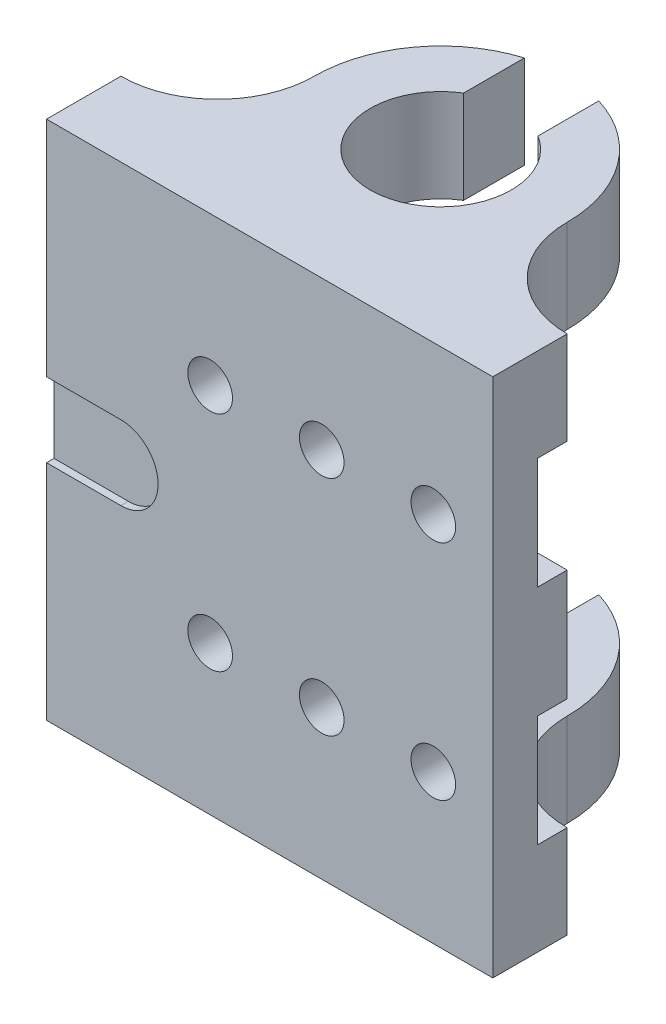
ISO-10303-21;
HEADER;
FILE_DESCRIPTION(('STEP AP214'),'2;1');
FILE_NAME('part.step','',(''),(''),'','','');
FILE_SCHEMA(('AUTOMOTIVE_DESIGN { 1 0 10303 214 1 1 1 1 }'));
ENDSEC;
DATA;
#1=APPLICATION_CONTEXT('core data for automotive mechanical design processes');
#2=APPLICATION_PROTOCOL_DEFINITION('international standard','automotive_design',2000,#1);
#3=PRODUCT_CONTEXT('',#1,'mechanical');
#4=PRODUCT('Part','Part','',(#3));
#5=PRODUCT_RELATED_PRODUCT_CATEGORY('part','',(#4));
#6=PRODUCT_DEFINITION_FORMATION('','',#4);
#7=PRODUCT_DEFINITION_CONTEXT('part definition',#1,'design');
#8=PRODUCT_DEFINITION('design','',#6,#7);
#9=PRODUCT_DEFINITION_SHAPE('','',#8);
#10=(LENGTH_UNIT() NAMED_UNIT(*) SI_UNIT(.MILLI.,.METRE.));
#11=(NAMED_UNIT(*) PLANE_ANGLE_UNIT() SI_UNIT($,.RADIAN.));
#12=(NAMED_UNIT(*) SI_UNIT($,.STERADIAN.) SOLID_ANGLE_UNIT());
#13=UNCERTAINTY_MEASURE_WITH_UNIT(LENGTH_MEASURE(1.E-05),#10,'distance_accuracy_value','');
#14=(GEOMETRIC_REPRESENTATION_CONTEXT(3) GLOBAL_UNCERTAINTY_ASSIGNED_CONTEXT((#13)) GLOBAL_UNIT_ASSIGNED_CONTEXT((#10,
#11,#12)) REPRESENTATION_CONTEXT('',''));
#15=CARTESIAN_POINT('',(0.,0.,0.));
#16=DIRECTION('',(0.,0.,1.));
#17=DIRECTION('',(1.,0.,0.));
#18=AXIS2_PLACEMENT_3D('',#15,#16,#17);
#19=CARTESIAN_POINT('',(-30.,-35.,10.));
#20=DIRECTION('',(0.,1.,0.));
#21=DIRECTION('',(0.,0.,1.));
#22=AXIS2_PLACEMENT_3D('',#19,#20,#21);
#23=PLANE('',#22);
#24=DIRECTION('',(0.,0.,1.));
#25=VECTOR('',#24,1.);
#26=CARTESIAN_POINT('',(-5.,-35.,0.));
#27=LINE('',#26,#25);
#28=CARTESIAN_POINT('',(-5.,-35.,-29.2480768092719));
#29=VERTEX_POINT('',#28);
#30=CARTESIAN_POINT('',(-5.,-35.,-21.0777472107018));
#31=VERTEX_POINT('',#30);
#32=EDGE_CURVE('E250',#29,#31,#27,.T.);
#33=ORIENTED_EDGE('',*,*,#32,.T.);
#34=CARTESIAN_POINT('',(0.,-35.,-13.));
#35=DIRECTION('',(0.,1.,0.));
#36=DIRECTION('',(0.,0.,1.));
#37=AXIS2_PLACEMENT_3D('',#34,#35,#36);
#38=CIRCLE('',#37,9.5);
#39=CARTESIAN_POINT('',(5.,-35.,-21.0777472107018));
#40=VERTEX_POINT('',#39);
#41=EDGE_CURVE('E258',#31,#40,#38,.T.);
#42=ORIENTED_EDGE('',*,*,#41,.T.);
#43=DIRECTION('',(0.,0.,1.));
#44=VECTOR('',#43,1.);
#45=CARTESIAN_POINT('',(5.,-35.,0.));
#46=LINE('',#45,#44);
#47=CARTESIAN_POINT('',(5.,-35.,-29.2480768092719));
#48=VERTEX_POINT('',#47);
#49=EDGE_CURVE('E243',#48,#40,#46,.T.);
#50=ORIENTED_EDGE('',*,*,#49,.F.);
#51=CARTESIAN_POINT('',(0.,-35.,-13.));
#52=DIRECTION('',(0.,1.,0.));
#53=DIRECTION('',(0.,0.,1.));
#54=AXIS2_PLACEMENT_3D('',#51,#52,#53);
#55=CIRCLE('',#54,17.);
#56=CARTESIAN_POINT('',(17.,-35.,-13.));
#57=VERTEX_POINT('',#56);
#58=EDGE_CURVE('E255',#48,#57,#55,.F.);
#59=ORIENTED_EDGE('',*,*,#58,.T.);
#60=CARTESIAN_POINT('',(30.,-35.,-13.));
#61=DIRECTION('',(0.,1.,0.));
#62=DIRECTION('',(0.,0.,1.));
#63=AXIS2_PLACEMENT_3D('',#60,#61,#62);
#64=CIRCLE('',#63,13.);
#65=CARTESIAN_POINT('',(30.,-35.,0.));
#66=VERTEX_POINT('',#65);
#67=EDGE_CURVE('E272',#66,#57,#64,.F.);
#68=ORIENTED_EDGE('',*,*,#67,.F.);
#69=DIRECTION('',(0.,0.,-1.));
#70=VECTOR('',#69,1.);
#71=CARTESIAN_POINT('',(30.,-35.,10.));
#72=LINE('',#71,#70);
#73=CARTESIAN_POINT('',(30.,-35.,10.));
#74=VERTEX_POINT('',#73);
#75=EDGE_CURVE('E536',#74,#66,#72,.T.);
#76=ORIENTED_EDGE('',*,*,#75,.F.);
#77=DIRECTION('',(1.,0.,0.));
#78=VECTOR('',#77,1.);
#79=CARTESIAN_POINT('',(-30.,-35.,10.));
#80=LINE('',#79,#78);
#81=CARTESIAN_POINT('',(-30.,-35.,10.));
#82=VERTEX_POINT('',#81);
#83=EDGE_CURVE('E533',#82,#74,#80,.T.);
#84=ORIENTED_EDGE('',*,*,#83,.F.);
#85=DIRECTION('',(0.,0.,-1.));
#86=VECTOR('',#85,1.);
#87=CARTESIAN_POINT('',(-30.,-35.,10.));
#88=LINE('',#87,#86);
#89=CARTESIAN_POINT('',(-30.,-35.,0.));
#90=VERTEX_POINT('',#89);
#91=EDGE_CURVE('E547',#82,#90,#88,.T.);
#92=ORIENTED_EDGE('',*,*,#91,.T.);
#93=CARTESIAN_POINT('',(-30.,-35.,-13.));
#94=DIRECTION('',(0.,1.,0.));
#95=DIRECTION('',(0.,0.,1.));
#96=AXIS2_PLACEMENT_3D('',#93,#94,#95);
#97=CIRCLE('',#96,13.);
#98=CARTESIAN_POINT('',(-17.,-35.,-13.));
#99=VERTEX_POINT('',#98);
#100=EDGE_CURVE('E267',#90,#99,#97,.T.);
#101=ORIENTED_EDGE('',*,*,#100,.T.);
#102=EDGE_CURVE('E266',#99,#29,#55,.F.);
#103=ORIENTED_EDGE('',*,*,#102,.T.);
#104=EDGE_LOOP('',(#33,#42,#50,#59,#68,#76,#84,#92,#101,#103));
#105=FACE_BOUND('',#104,.T.);
#106=ADVANCED_FACE('F47',(#105),#23,.F.);
#107=CARTESIAN_POINT('',(0.,-22.5,4.));
#108=DIRECTION('',(0.,1.,0.));
#109=DIRECTION('',(0.,0.,1.));
#110=AXIS2_PLACEMENT_3D('',#107,#108,#109);
#111=PLANE('',#110);
#112=CARTESIAN_POINT('',(0.,-22.5,-13.));
#113=DIRECTION('',(0.,-1.,0.));
#114=DIRECTION('',(0.,0.,-1.));
#115=AXIS2_PLACEMENT_3D('',#112,#113,#114);
#116=CIRCLE('',#115,9.5);
#117=CARTESIAN_POINT('',(5.,-22.5,-21.0777472107018));
#118=VERTEX_POINT('',#117);
#119=CARTESIAN_POINT('',(-5.,-22.5,-21.0777472107018));
#120=VERTEX_POINT('',#119);
#121=EDGE_CURVE('E604',#118,#120,#116,.T.);
#122=ORIENTED_EDGE('',*,*,#121,.T.);
#123=DIRECTION('',(0.,0.,-1.));
#124=VECTOR('',#123,1.);
#125=CARTESIAN_POINT('',(-5.,-22.5,0.));
#126=LINE('',#125,#124);
#127=CARTESIAN_POINT('',(-5.,-22.5,-29.2480768092719));
#128=VERTEX_POINT('',#127);
#129=EDGE_CURVE('E593',#120,#128,#126,.T.);
#130=ORIENTED_EDGE('',*,*,#129,.T.);
#131=CARTESIAN_POINT('',(0.,-22.5,-13.));
#132=DIRECTION('',(0.,1.,0.));
#133=DIRECTION('',(0.,0.,1.));
#134=AXIS2_PLACEMENT_3D('',#131,#132,#133);
#135=CIRCLE('',#134,17.);
#136=CARTESIAN_POINT('',(-17.,-22.5,-13.));
#137=VERTEX_POINT('',#136);
#138=EDGE_CURVE('E580',#137,#128,#135,.F.);
#139=ORIENTED_EDGE('',*,*,#138,.F.);
#140=CARTESIAN_POINT('',(-30.,-22.5,-13.));
#141=DIRECTION('',(0.,1.,0.));
#142=DIRECTION('',(0.,0.,1.));
#143=AXIS2_PLACEMENT_3D('',#140,#141,#142);
#144=CIRCLE('',#143,13.);
#145=CARTESIAN_POINT('',(-30.,-22.5,0.));
#146=VERTEX_POINT('',#145);
#147=EDGE_CURVE('E586',#146,#137,#144,.T.);
#148=ORIENTED_EDGE('',*,*,#147,.F.);
#149=DIRECTION('',(-1.,0.,0.));
#150=VECTOR('',#149,1.);
#151=CARTESIAN_POINT('',(0.,-22.5,0.));
#152=LINE('',#151,#150);
#153=CARTESIAN_POINT('',(-8.,-22.5,0.));
#154=VERTEX_POINT('',#153);
#155=EDGE_CURVE('E71',#154,#146,#152,.T.);
#156=ORIENTED_EDGE('',*,*,#155,.F.);
#157=DIRECTION('',(0.,0.,-1.));
#158=VECTOR('',#157,1.);
#159=CARTESIAN_POINT('',(-8.,-22.5,4.));
#160=LINE('',#159,#158);
#161=CARTESIAN_POINT('',(-8.,-22.5,4.));
#162=VERTEX_POINT('',#161);
#163=EDGE_CURVE('E431',#162,#154,#160,.T.);
#164=ORIENTED_EDGE('',*,*,#163,.F.);
#165=DIRECTION('',(1.,0.,0.));
#166=VECTOR('',#165,1.);
#167=CARTESIAN_POINT('',(0.,-22.5,4.));
#168=LINE('',#167,#166);
#169=CARTESIAN_POINT('',(30.,-22.5,4.));
#170=VERTEX_POINT('',#169);
#171=EDGE_CURVE('E415',#162,#170,#168,.T.);
#172=ORIENTED_EDGE('',*,*,#171,.T.);
#173=DIRECTION('',(0.,0.,-1.));
#174=VECTOR('',#173,1.);
#175=CARTESIAN_POINT('',(30.,-22.5,4.));
#176=LINE('',#175,#174);
#177=CARTESIAN_POINT('',(30.,-22.5,0.));
#178=VERTEX_POINT('',#177);
#179=EDGE_CURVE('E435',#170,#178,#176,.T.);
#180=ORIENTED_EDGE('',*,*,#179,.T.);
#181=CARTESIAN_POINT('',(30.,-22.5,-13.));
#182=DIRECTION('',(0.,1.,0.));
#183=DIRECTION('',(0.,0.,1.));
#184=AXIS2_PLACEMENT_3D('',#181,#182,#183);
#185=CIRCLE('',#184,13.);
#186=CARTESIAN_POINT('',(17.,-22.5,-13.));
#187=VERTEX_POINT('',#186);
#188=EDGE_CURVE('E288',#178,#187,#185,.F.);
#189=ORIENTED_EDGE('',*,*,#188,.T.);
#190=CARTESIAN_POINT('',(5.,-22.5,-29.2480768092719));
#191=VERTEX_POINT('',#190);
#192=EDGE_CURVE('E583',#191,#187,#135,.F.);
#193=ORIENTED_EDGE('',*,*,#192,.F.);
#194=DIRECTION('',(0.,0.,-1.));
#195=VECTOR('',#194,1.);
#196=CARTESIAN_POINT('',(5.,-22.5,0.));
#197=LINE('',#196,#195);
#198=EDGE_CURVE('E63',#118,#191,#197,.T.);
#199=ORIENTED_EDGE('',*,*,#198,.F.);
#200=EDGE_LOOP('',(#122,#130,#139,#148,#156,#164,#172,#180,#189,#193,#199));
#201=FACE_BOUND('',#200,.T.);
#202=ADVANCED_FACE('F615',(#201),#111,.T.);
#203=CARTESIAN_POINT('',(0.,-22.5,-13.));
#204=DIRECTION('',(0.,-1.,0.));
#205=DIRECTION('',(0.,0.,-1.));
#206=AXIS2_PLACEMENT_3D('',#203,#204,#205);
#207=CYLINDRICAL_SURFACE('',#206,17.);
#208=ORIENTED_EDGE('',*,*,#138,.T.);
#209=DIRECTION('',(0.,-1.,0.));
#210=VECTOR('',#209,1.);
#211=CARTESIAN_POINT('',(-5.,55.1075144713607,-29.2480768092719));
#212=LINE('',#211,#210);
#213=EDGE_CURVE('E600',#128,#29,#212,.T.);
#214=ORIENTED_EDGE('',*,*,#213,.T.);
#215=ORIENTED_EDGE('',*,*,#102,.F.);
#216=DIRECTION('',(0.,-1.,0.));
#217=VECTOR('',#216,1.);
#218=CARTESIAN_POINT('',(-17.,-22.5,-13.));
#219=LINE('',#218,#217);
#220=EDGE_CURVE('E282',#137,#99,#219,.T.);
#221=ORIENTED_EDGE('',*,*,#220,.F.);
#222=EDGE_LOOP('',(#208,#214,#215,#221));
#223=FACE_BOUND('',#222,.T.);
#224=ADVANCED_FACE('F624',(#223),#207,.T.);
#225=CARTESIAN_POINT('',(0.,0.,0.));
#226=DIRECTION('',(0.,0.,1.));
#227=DIRECTION('',(1.,0.,0.));
#228=AXIS2_PLACEMENT_3D('',#225,#226,#227);
#229=PLANE('',#228);
#230=ORIENTED_EDGE('',*,*,#155,.T.);
#231=DIRECTION('',(0.,-1.,0.));
#232=VECTOR('',#231,1.);
#233=CARTESIAN_POINT('',(-30.,35.,0.));
#234=LINE('',#233,#232);
#235=CARTESIAN_POINT('',(-30.,22.5,0.));
#236=VERTEX_POINT('',#235);
#237=EDGE_CURVE('E540',#236,#146,#234,.T.);
#238=ORIENTED_EDGE('',*,*,#237,.F.);
#239=DIRECTION('',(-1.,0.,0.));
#240=VECTOR('',#239,1.);
#241=CARTESIAN_POINT('',(0.,22.5,0.));
#242=LINE('',#241,#240);
#243=CARTESIAN_POINT('',(-8.,22.5,0.));
#244=VERTEX_POINT('',#243);
#245=EDGE_CURVE('E324',#244,#236,#242,.T.);
#246=ORIENTED_EDGE('',*,*,#245,.F.);
#247=CARTESIAN_POINT('',(-8.,15.,0.));
#248=DIRECTION('',(0.,0.,-1.));
#249=DIRECTION('',(-1.,0.,0.));
#250=AXIS2_PLACEMENT_3D('',#247,#248,#249);
#251=CIRCLE('',#250,7.5);
#252=CARTESIAN_POINT('',(-8.00000000000001,7.5,0.));
#253=VERTEX_POINT('',#252);
#254=EDGE_CURVE('E434',#253,#244,#251,.T.);
#255=ORIENTED_EDGE('',*,*,#254,.F.);
#256=DIRECTION('',(1.,0.,0.));
#257=VECTOR('',#256,1.);
#258=CARTESIAN_POINT('',(0.,7.5,0.));
#259=LINE('',#258,#257);
#260=CARTESIAN_POINT('',(30.,7.5,0.));
#261=VERTEX_POINT('',#260);
#262=EDGE_CURVE('E451',#253,#261,#259,.T.);
#263=ORIENTED_EDGE('',*,*,#262,.T.);
#264=DIRECTION('',(0.,1.,0.));
#265=VECTOR('',#264,1.);
#266=CARTESIAN_POINT('',(30.,35.,0.));
#267=LINE('',#266,#265);
#268=CARTESIAN_POINT('',(30.,-7.5,0.));
#269=VERTEX_POINT('',#268);
#270=EDGE_CURVE('E541',#269,#261,#267,.T.);
#271=ORIENTED_EDGE('',*,*,#270,.F.);
#272=DIRECTION('',(1.,0.,0.));
#273=VECTOR('',#272,1.);
#274=CARTESIAN_POINT('',(0.,-7.5,0.));
#275=LINE('',#274,#273);
#276=CARTESIAN_POINT('',(-8.00000000000001,-7.5,0.));
#277=VERTEX_POINT('',#276);
#278=EDGE_CURVE('E403',#277,#269,#275,.T.);
#279=ORIENTED_EDGE('',*,*,#278,.F.);
#280=CARTESIAN_POINT('',(-8.,-15.,0.));
#281=DIRECTION('',(0.,0.,1.));
#282=DIRECTION('',(-1.,0.,0.));
#283=AXIS2_PLACEMENT_3D('',#280,#281,#282);
#284=CIRCLE('',#283,7.5);
#285=EDGE_CURVE('E387',#277,#154,#284,.T.);
#286=ORIENTED_EDGE('',*,*,#285,.T.);
#287=EDGE_LOOP('',(#230,#238,#246,#255,#263,#271,#279,#286));
#288=FACE_BOUND('',#287,.T.);
#289=ADVANCED_FACE('F568',(#288),#229,.F.);
#290=CARTESIAN_POINT('',(-30.,35.,10.));
#291=DIRECTION('',(0.,-1.,0.));
#292=DIRECTION('',(0.,0.,-1.));
#293=AXIS2_PLACEMENT_3D('',#290,#291,#292);
#294=PLANE('',#293);
#295=DIRECTION('',(0.,0.,1.));
#296=VECTOR('',#295,1.);
#297=CARTESIAN_POINT('',(5.,35.,0.));
#298=LINE('',#297,#296);
#299=CARTESIAN_POINT('',(5.,35.,-29.2480768092719));
#300=VERTEX_POINT('',#299);
#301=CARTESIAN_POINT('',(5.,35.,-21.0777472107018));
#302=VERTEX_POINT('',#301);
#303=EDGE_CURVE('E305',#300,#302,#298,.T.);
#304=ORIENTED_EDGE('',*,*,#303,.T.);
#305=CARTESIAN_POINT('',(0.,35.,-13.));
#306=DIRECTION('',(0.,1.,0.));
#307=DIRECTION('',(0.,0.,1.));
#308=AXIS2_PLACEMENT_3D('',#305,#306,#307);
#309=CIRCLE('',#308,9.5);
#310=CARTESIAN_POINT('',(-5.,35.,-21.0777472107018));
#311=VERTEX_POINT('',#310);
#312=EDGE_CURVE('E301',#311,#302,#309,.T.);
#313=ORIENTED_EDGE('',*,*,#312,.F.);
#314=DIRECTION('',(0.,0.,1.));
#315=VECTOR('',#314,1.);
#316=CARTESIAN_POINT('',(-5.,35.,0.));
#317=LINE('',#316,#315);
#318=CARTESIAN_POINT('',(-5.,35.,-29.2480768092719));
#319=VERTEX_POINT('',#318);
#320=EDGE_CURVE('E281',#319,#311,#317,.T.);
#321=ORIENTED_EDGE('',*,*,#320,.F.);
#322=CARTESIAN_POINT('',(0.,35.,-13.));
#323=DIRECTION('',(0.,1.,0.));
#324=DIRECTION('',(0.,0.,1.));
#325=AXIS2_PLACEMENT_3D('',#322,#323,#324);
#326=CIRCLE('',#325,17.);
#327=CARTESIAN_POINT('',(-17.,35.,-13.));
#328=VERTEX_POINT('',#327);
#329=EDGE_CURVE('E345',#328,#319,#326,.F.);
#330=ORIENTED_EDGE('',*,*,#329,.F.);
#331=CARTESIAN_POINT('',(-30.,35.,-13.));
#332=DIRECTION('',(0.,1.,0.));
#333=DIRECTION('',(0.,0.,1.));
#334=AXIS2_PLACEMENT_3D('',#331,#332,#333);
#335=CIRCLE('',#334,13.);
#336=CARTESIAN_POINT('',(-30.,35.,0.));
#337=VERTEX_POINT('',#336);
#338=EDGE_CURVE('E328',#337,#328,#335,.T.);
#339=ORIENTED_EDGE('',*,*,#338,.F.);
#340=DIRECTION('',(0.,0.,-1.));
#341=VECTOR('',#340,1.);
#342=CARTESIAN_POINT('',(-30.,35.,10.));
#343=LINE('',#342,#341);
#344=CARTESIAN_POINT('',(-30.,35.,10.));
#345=VERTEX_POINT('',#344);
#346=EDGE_CURVE('E56',#345,#337,#343,.T.);
#347=ORIENTED_EDGE('',*,*,#346,.F.);
#348=DIRECTION('',(-1.,0.,0.));
#349=VECTOR('',#348,1.);
#350=CARTESIAN_POINT('',(-30.,35.,10.));
#351=LINE('',#350,#349);
#352=CARTESIAN_POINT('',(30.,35.,10.));
#353=VERTEX_POINT('',#352);
#354=EDGE_CURVE('E524',#353,#345,#351,.T.);
#355=ORIENTED_EDGE('',*,*,#354,.F.);
#356=DIRECTION('',(0.,0.,-1.));
#357=VECTOR('',#356,1.);
#358=CARTESIAN_POINT('',(30.,35.,10.));
#359=LINE('',#358,#357);
#360=CARTESIAN_POINT('',(30.,35.,0.));
#361=VERTEX_POINT('',#360);
#362=EDGE_CURVE('E11',#353,#361,#359,.T.);
#363=ORIENTED_EDGE('',*,*,#362,.T.);
#364=CARTESIAN_POINT('',(30.,35.,-13.));
#365=DIRECTION('',(0.,1.,0.));
#366=DIRECTION('',(0.,0.,1.));
#367=AXIS2_PLACEMENT_3D('',#364,#365,#366);
#368=CIRCLE('',#367,13.);
#369=CARTESIAN_POINT('',(17.,35.,-13.));
#370=VERTEX_POINT('',#369);
#371=EDGE_CURVE('E323',#361,#370,#368,.F.);
#372=ORIENTED_EDGE('',*,*,#371,.T.);
#373=EDGE_CURVE('E344',#300,#370,#326,.F.);
#374=ORIENTED_EDGE('',*,*,#373,.F.);
#375=EDGE_LOOP('',(#304,#313,#321,#330,#339,#347,#355,#363,#372,#374));
#376=FACE_BOUND('',#375,.T.);
#377=ADVANCED_FACE('F559',(#376),#294,.F.);
#378=CARTESIAN_POINT('',(0.,22.5,4.));
#379=DIRECTION('',(0.,1.,0.));
#380=DIRECTION('',(0.,0.,1.));
#381=AXIS2_PLACEMENT_3D('',#378,#379,#380);
#382=PLANE('',#381);
#383=DIRECTION('',(0.,0.,-1.));
#384=VECTOR('',#383,1.);
#385=CARTESIAN_POINT('',(5.,22.5,0.));
#386=LINE('',#385,#384);
#387=CARTESIAN_POINT('',(5.,22.5,-21.0777472107018));
#388=VERTEX_POINT('',#387);
#389=CARTESIAN_POINT('',(5.,22.5,-29.2480768092719));
#390=VERTEX_POINT('',#389);
#391=EDGE_CURVE('E292',#388,#390,#386,.T.);
#392=ORIENTED_EDGE('',*,*,#391,.T.);
#393=CARTESIAN_POINT('',(0.,22.5,-13.));
#394=DIRECTION('',(0.,1.,0.));
#395=DIRECTION('',(0.,0.,1.));
#396=AXIS2_PLACEMENT_3D('',#393,#394,#395);
#397=CIRCLE('',#396,17.);
#398=CARTESIAN_POINT('',(17.,22.5,-13.));
#399=VERTEX_POINT('',#398);
#400=EDGE_CURVE('E332',#390,#399,#397,.F.);
#401=ORIENTED_EDGE('',*,*,#400,.T.);
#402=CARTESIAN_POINT('',(30.,22.5,-13.));
#403=DIRECTION('',(0.,1.,0.));
#404=DIRECTION('',(0.,0.,1.));
#405=AXIS2_PLACEMENT_3D('',#402,#403,#404);
#406=CIRCLE('',#405,13.);
#407=CARTESIAN_POINT('',(30.,22.5,0.));
#408=VERTEX_POINT('',#407);
#409=EDGE_CURVE('E327',#408,#399,#406,.F.);
#410=ORIENTED_EDGE('',*,*,#409,.F.);
#411=DIRECTION('',(0.,0.,-1.));
#412=VECTOR('',#411,1.);
#413=CARTESIAN_POINT('',(30.,22.5,4.));
#414=LINE('',#413,#412);
#415=CARTESIAN_POINT('',(30.,22.5,4.));
#416=VERTEX_POINT('',#415);
#417=EDGE_CURVE('E489',#416,#408,#414,.T.);
#418=ORIENTED_EDGE('',*,*,#417,.F.);
#419=DIRECTION('',(1.,0.,0.));
#420=VECTOR('',#419,1.);
#421=CARTESIAN_POINT('',(0.,22.5,4.));
#422=LINE('',#421,#420);
#423=CARTESIAN_POINT('',(-8.,22.5,4.));
#424=VERTEX_POINT('',#423);
#425=EDGE_CURVE('E455',#424,#416,#422,.T.);
#426=ORIENTED_EDGE('',*,*,#425,.F.);
#427=DIRECTION('',(0.,0.,-1.));
#428=VECTOR('',#427,1.);
#429=CARTESIAN_POINT('',(-8.,22.5,4.));
#430=LINE('',#429,#428);
#431=EDGE_CURVE('E474',#424,#244,#430,.T.);
#432=ORIENTED_EDGE('',*,*,#431,.T.);
#433=ORIENTED_EDGE('',*,*,#245,.T.);
#434=CARTESIAN_POINT('',(-30.,22.5,-13.));
#435=DIRECTION('',(0.,1.,0.));
#436=DIRECTION('',(0.,0.,1.));
#437=AXIS2_PLACEMENT_3D('',#434,#435,#436);
#438=CIRCLE('',#437,13.);
#439=CARTESIAN_POINT('',(-17.,22.5,-13.));
#440=VERTEX_POINT('',#439);
#441=EDGE_CURVE('E337',#236,#440,#438,.T.);
#442=ORIENTED_EDGE('',*,*,#441,.T.);
#443=CARTESIAN_POINT('',(-5.,22.5,-29.2480768092719));
#444=VERTEX_POINT('',#443);
#445=EDGE_CURVE('E333',#440,#444,#397,.F.);
#446=ORIENTED_EDGE('',*,*,#445,.T.);
#447=DIRECTION('',(0.,0.,-1.));
#448=VECTOR('',#447,1.);
#449=CARTESIAN_POINT('',(-5.,22.5,0.));
#450=LINE('',#449,#448);
#451=CARTESIAN_POINT('',(-5.,22.5,-21.0777472107018));
#452=VERTEX_POINT('',#451);
#453=EDGE_CURVE('E297',#452,#444,#450,.T.);
#454=ORIENTED_EDGE('',*,*,#453,.F.);
#455=CARTESIAN_POINT('',(0.,22.5,-13.));
#456=DIRECTION('',(0.,1.,0.));
#457=DIRECTION('',(0.,0.,1.));
#458=AXIS2_PLACEMENT_3D('',#455,#456,#457);
#459=CIRCLE('',#458,9.5);
#460=EDGE_CURVE('E289',#388,#452,#459,.F.);
#461=ORIENTED_EDGE('',*,*,#460,.F.);
#462=EDGE_LOOP('',(#392,#401,#410,#418,#426,#432,#433,#442,#446,#454,#461));
#463=FACE_BOUND('',#462,.T.);
#464=ADVANCED_FACE('F683',(#463),#382,.F.);
#465=CARTESIAN_POINT('',(0.,22.5,-13.));
#466=DIRECTION('',(0.,1.,0.));
#467=DIRECTION('',(0.,0.,1.));
#468=AXIS2_PLACEMENT_3D('',#465,#466,#467);
#469=CYLINDRICAL_SURFACE('',#468,17.);
#470=DIRECTION('',(0.,1.,0.));
#471=VECTOR('',#470,1.);
#472=CARTESIAN_POINT('',(5.,-10.1075144713607,-29.2480768092719));
#473=LINE('',#472,#471);
#474=EDGE_CURVE('E293',#390,#300,#473,.T.);
#475=ORIENTED_EDGE('',*,*,#474,.T.);
#476=ORIENTED_EDGE('',*,*,#373,.T.);
#477=DIRECTION('',(0.,1.,0.));
#478=VECTOR('',#477,1.);
#479=CARTESIAN_POINT('',(17.,22.5,-13.));
#480=LINE('',#479,#478);
#481=EDGE_CURVE('E340',#399,#370,#480,.T.);
#482=ORIENTED_EDGE('',*,*,#481,.F.);
#483=ORIENTED_EDGE('',*,*,#400,.F.);
#484=EDGE_LOOP('',(#475,#476,#482,#483));
#485=FACE_BOUND('',#484,.T.);
#486=ADVANCED_FACE('F681',(#485),#469,.T.);
#487=CARTESIAN_POINT('',(-30.,35.,10.));
#488=DIRECTION('',(1.,0.,0.));
#489=DIRECTION('',(0.,1.,0.));
#490=AXIS2_PLACEMENT_3D('',#487,#488,#489);
#491=PLANE('',#490);
#492=DIRECTION('',(0.,0.,1.));
#493=VECTOR('',#492,1.);
#494=CARTESIAN_POINT('',(-30.,-5.,9.));
#495=LINE('',#494,#493);
#496=CARTESIAN_POINT('',(-30.,-5.,9.));
#497=VERTEX_POINT('',#496);
#498=CARTESIAN_POINT('',(-30.,-5.,10.));
#499=VERTEX_POINT('',#498);
#500=EDGE_CURVE('E388',#497,#499,#495,.T.);
#501=ORIENTED_EDGE('',*,*,#500,.F.);
#502=DIRECTION('',(0.,-1.,0.));
#503=VECTOR('',#502,1.);
#504=CARTESIAN_POINT('',(-30.,0.,9.));
#505=LINE('',#504,#503);
#506=CARTESIAN_POINT('',(-30.,5.,9.));
#507=VERTEX_POINT('',#506);
#508=EDGE_CURVE('E368',#507,#497,#505,.T.);
#509=ORIENTED_EDGE('',*,*,#508,.F.);
#510=DIRECTION('',(0.,0.,1.));
#511=VECTOR('',#510,1.);
#512=CARTESIAN_POINT('',(-30.,5.,9.));
#513=LINE('',#512,#511);
#514=CARTESIAN_POINT('',(-30.,5.,10.));
#515=VERTEX_POINT('',#514);
#516=EDGE_CURVE('E391',#507,#515,#513,.T.);
#517=ORIENTED_EDGE('',*,*,#516,.T.);
#518=DIRECTION('',(0.,-1.,0.));
#519=VECTOR('',#518,1.);
#520=CARTESIAN_POINT('',(-30.,35.,10.));
#521=LINE('',#520,#519);
#522=EDGE_CURVE('E529',#345,#515,#521,.T.);
#523=ORIENTED_EDGE('',*,*,#522,.F.);
#524=ORIENTED_EDGE('',*,*,#346,.T.);
#525=EDGE_CURVE('E525',#337,#236,#234,.T.);
#526=ORIENTED_EDGE('',*,*,#525,.T.);
#527=ORIENTED_EDGE('',*,*,#237,.T.);
#528=DIRECTION('',(0.,-1.,0.));
#529=VECTOR('',#528,1.);
#530=CARTESIAN_POINT('',(-30.,-22.5,0.));
#531=LINE('',#530,#529);
#532=EDGE_CURVE('E285',#146,#90,#531,.T.);
#533=ORIENTED_EDGE('',*,*,#532,.T.);
#534=ORIENTED_EDGE('',*,*,#91,.F.);
#535=EDGE_CURVE('E528',#499,#82,#521,.T.);
#536=ORIENTED_EDGE('',*,*,#535,.F.);
#537=EDGE_LOOP('',(#501,#509,#517,#523,#524,#526,#527,#533,#534,#536));
#538=FACE_BOUND('',#537,.T.);
#539=ADVANCED_FACE('F556',(#538),#491,.F.);
#540=CARTESIAN_POINT('',(0.,0.,10.));
#541=DIRECTION('',(0.,0.,1.));
#542=DIRECTION('',(1.,0.,0.));
#543=AXIS2_PLACEMENT_3D('',#540,#541,#542);
#544=PLANE('',#543);
#545=CARTESIAN_POINT('',(22.,-15.,10.));
#546=DIRECTION('',(0.,0.,1.));
#547=DIRECTION('',(1.,0.,0.));
#548=AXIS2_PLACEMENT_3D('',#545,#546,#547);
#549=CIRCLE('',#548,3.);
#550=CARTESIAN_POINT('',(25.,-15.,10.));
#551=VERTEX_POINT('',#550);
#552=EDGE_CURVE('E484',#551,#551,#549,.T.);
#553=ORIENTED_EDGE('',*,*,#552,.F.);
#554=EDGE_LOOP('',(#553));
#555=FACE_BOUND('',#554,.T.);
#556=CARTESIAN_POINT('',(7.,-15.,10.));
#557=DIRECTION('',(0.,0.,1.));
#558=DIRECTION('',(1.,0.,0.));
#559=AXIS2_PLACEMENT_3D('',#556,#557,#558);
#560=CIRCLE('',#559,3.);
#561=CARTESIAN_POINT('',(10.,-15.,10.));
#562=VERTEX_POINT('',#561);
#563=EDGE_CURVE('E509',#562,#562,#560,.T.);
#564=ORIENTED_EDGE('',*,*,#563,.F.);
#565=EDGE_LOOP('',(#564));
#566=FACE_BOUND('',#565,.T.);
#567=CARTESIAN_POINT('',(-8.,-15.,10.));
#568=DIRECTION('',(0.,0.,1.));
#569=DIRECTION('',(1.,0.,0.));
#570=AXIS2_PLACEMENT_3D('',#567,#568,#569);
#571=CIRCLE('',#570,3.);
#572=CARTESIAN_POINT('',(-5.,-15.,10.));
#573=VERTEX_POINT('',#572);
#574=EDGE_CURVE('E505',#573,#573,#571,.T.);
#575=ORIENTED_EDGE('',*,*,#574,.F.);
#576=EDGE_LOOP('',(#575));
#577=FACE_BOUND('',#576,.T.);
#578=CARTESIAN_POINT('',(7.,15.,10.));
#579=DIRECTION('',(0.,0.,1.));
#580=DIRECTION('',(1.,0.,0.));
#581=AXIS2_PLACEMENT_3D('',#578,#579,#580);
#582=CIRCLE('',#581,3.);
#583=CARTESIAN_POINT('',(10.,15.,10.));
#584=VERTEX_POINT('',#583);
#585=EDGE_CURVE('E501',#584,#584,#582,.T.);
#586=ORIENTED_EDGE('',*,*,#585,.F.);
#587=EDGE_LOOP('',(#586));
#588=FACE_BOUND('',#587,.T.);
#589=CARTESIAN_POINT('',(-8.,15.,10.));
#590=DIRECTION('',(0.,0.,1.));
#591=DIRECTION('',(1.,0.,0.));
#592=AXIS2_PLACEMENT_3D('',#589,#590,#591);
#593=CIRCLE('',#592,3.);
#594=CARTESIAN_POINT('',(-5.,15.,10.));
#595=VERTEX_POINT('',#594);
#596=EDGE_CURVE('E496',#595,#595,#593,.T.);
#597=ORIENTED_EDGE('',*,*,#596,.F.);
#598=EDGE_LOOP('',(#597));
#599=FACE_BOUND('',#598,.T.);
#600=CARTESIAN_POINT('',(22.,15.,10.));
#601=DIRECTION('',(0.,0.,1.));
#602=DIRECTION('',(1.,0.,0.));
#603=AXIS2_PLACEMENT_3D('',#600,#601,#602);
#604=CIRCLE('',#603,3.);
#605=CARTESIAN_POINT('',(25.,15.,10.));
#606=VERTEX_POINT('',#605);
#607=EDGE_CURVE('E500',#606,#606,#604,.T.);
#608=ORIENTED_EDGE('',*,*,#607,.F.);
#609=EDGE_LOOP('',(#608));
#610=FACE_BOUND('',#609,.T.);
#611=CARTESIAN_POINT('',(-20.,0.,10.));
#612=DIRECTION('',(0.,0.,1.));
#613=DIRECTION('',(1.,0.,0.));
#614=AXIS2_PLACEMENT_3D('',#611,#612,#613);
#615=CIRCLE('',#614,5.);
#616=CARTESIAN_POINT('',(-20.,-5.,10.));
#617=VERTEX_POINT('',#616);
#618=CARTESIAN_POINT('',(-20.,5.,10.));
#619=VERTEX_POINT('',#618);
#620=EDGE_CURVE('E355',#617,#619,#615,.T.);
#621=ORIENTED_EDGE('',*,*,#620,.F.);
#622=DIRECTION('',(-1.,0.,0.));
#623=VECTOR('',#622,1.);
#624=CARTESIAN_POINT('',(0.,-5.,10.));
#625=LINE('',#624,#623);
#626=EDGE_CURVE('E364',#617,#499,#625,.T.);
#627=ORIENTED_EDGE('',*,*,#626,.T.);
#628=ORIENTED_EDGE('',*,*,#535,.T.);
#629=ORIENTED_EDGE('',*,*,#83,.T.);
#630=DIRECTION('',(0.,1.,0.));
#631=VECTOR('',#630,1.);
#632=CARTESIAN_POINT('',(30.,35.,10.));
#633=LINE('',#632,#631);
#634=EDGE_CURVE('E520',#74,#353,#633,.T.);
#635=ORIENTED_EDGE('',*,*,#634,.T.);
#636=ORIENTED_EDGE('',*,*,#354,.T.);
#637=ORIENTED_EDGE('',*,*,#522,.T.);
#638=DIRECTION('',(-1.,0.,0.));
#639=VECTOR('',#638,1.);
#640=CARTESIAN_POINT('',(0.,5.,10.));
#641=LINE('',#640,#639);
#642=EDGE_CURVE('E378',#619,#515,#641,.T.);
#643=ORIENTED_EDGE('',*,*,#642,.F.);
#644=EDGE_LOOP('',(#621,#627,#628,#629,#635,#636,#637,#643));
#645=FACE_BOUND('',#644,.T.);
#646=ADVANCED_FACE('F680',(#555,#566,#577,#588,#599,#610,#645),#544,.T.);
#647=CARTESIAN_POINT('',(30.,35.,10.));
#648=DIRECTION('',(-1.,0.,0.));
#649=DIRECTION('',(0.,-1.,0.));
#650=AXIS2_PLACEMENT_3D('',#647,#648,#649);
#651=PLANE('',#650);
#652=ORIENTED_EDGE('',*,*,#179,.F.);
#653=DIRECTION('',(0.,1.,0.));
#654=VECTOR('',#653,1.);
#655=CARTESIAN_POINT('',(30.,0.,4.));
#656=LINE('',#655,#654);
#657=CARTESIAN_POINT('',(30.,-7.5,4.));
#658=VERTEX_POINT('',#657);
#659=EDGE_CURVE('E411',#170,#658,#656,.T.);
#660=ORIENTED_EDGE('',*,*,#659,.T.);
#661=DIRECTION('',(0.,0.,-1.));
#662=VECTOR('',#661,1.);
#663=CARTESIAN_POINT('',(30.,-7.5,4.));
#664=LINE('',#663,#662);
#665=EDGE_CURVE('E439',#658,#269,#664,.T.);
#666=ORIENTED_EDGE('',*,*,#665,.T.);
#667=ORIENTED_EDGE('',*,*,#270,.T.);
#668=DIRECTION('',(0.,0.,-1.));
#669=VECTOR('',#668,1.);
#670=CARTESIAN_POINT('',(30.,7.5,4.));
#671=LINE('',#670,#669);
#672=CARTESIAN_POINT('',(30.,7.5,4.));
#673=VERTEX_POINT('',#672);
#674=EDGE_CURVE('E485',#673,#261,#671,.T.);
#675=ORIENTED_EDGE('',*,*,#674,.F.);
#676=DIRECTION('',(0.,-1.,0.));
#677=VECTOR('',#676,1.);
#678=CARTESIAN_POINT('',(30.,0.,4.));
#679=LINE('',#678,#677);
#680=EDGE_CURVE('E459',#416,#673,#679,.T.);
#681=ORIENTED_EDGE('',*,*,#680,.F.);
#682=ORIENTED_EDGE('',*,*,#417,.T.);
#683=EDGE_CURVE('E519',#408,#361,#267,.T.);
#684=ORIENTED_EDGE('',*,*,#683,.T.);
#685=ORIENTED_EDGE('',*,*,#362,.F.);
#686=ORIENTED_EDGE('',*,*,#634,.F.);
#687=ORIENTED_EDGE('',*,*,#75,.T.);
#688=EDGE_CURVE('E537',#66,#178,#267,.T.);
#689=ORIENTED_EDGE('',*,*,#688,.T.);
#690=EDGE_LOOP('',(#652,#660,#666,#667,#675,#681,#682,#684,#685,#686,#687,#689));
#691=FACE_BOUND('',#690,.T.);
#692=ADVANCED_FACE('F49',(#691),#651,.F.);
#693=CARTESIAN_POINT('',(-8.,-15.,0.));
#694=DIRECTION('',(0.,0.,1.));
#695=DIRECTION('',(1.,0.,0.));
#696=AXIS2_PLACEMENT_3D('',#693,#694,#695);
#697=CYLINDRICAL_SURFACE('',#696,3.);
#698=ORIENTED_EDGE('',*,*,#574,.T.);
#699=EDGE_LOOP('',(#698));
#700=FACE_BOUND('',#699,.T.);
#701=CARTESIAN_POINT('',(-8.,-15.,4.));
#702=DIRECTION('',(0.,0.,1.));
#703=DIRECTION('',(-1.,0.,0.));
#704=AXIS2_PLACEMENT_3D('',#701,#702,#703);
#705=CIRCLE('',#704,3.);
#706=CARTESIAN_POINT('',(-11.,-15.,4.));
#707=VERTEX_POINT('',#706);
#708=EDGE_CURVE('E398',#707,#707,#705,.F.);
#709=ORIENTED_EDGE('',*,*,#708,.T.);
#710=EDGE_LOOP('',(#709));
#711=FACE_BOUND('',#710,.T.);
#712=ADVANCED_FACE('F658',(#700,#711),#697,.F.);
#713=CARTESIAN_POINT('',(7.,-15.,0.));
#714=DIRECTION('',(0.,0.,1.));
#715=DIRECTION('',(1.,0.,0.));
#716=AXIS2_PLACEMENT_3D('',#713,#714,#715);
#717=CYLINDRICAL_SURFACE('',#716,3.);
#718=ORIENTED_EDGE('',*,*,#563,.T.);
#719=EDGE_LOOP('',(#718));
#720=FACE_BOUND('',#719,.T.);
#721=CARTESIAN_POINT('',(7.,-15.,4.));
#722=DIRECTION('',(0.,0.,1.));
#723=DIRECTION('',(-1.,0.,0.));
#724=AXIS2_PLACEMENT_3D('',#721,#722,#723);
#725=CIRCLE('',#724,3.);
#726=CARTESIAN_POINT('',(3.99999999999999,-15.,4.));
#727=VERTEX_POINT('',#726);
#728=EDGE_CURVE('E422',#727,#727,#725,.F.);
#729=ORIENTED_EDGE('',*,*,#728,.T.);
#730=EDGE_LOOP('',(#729));
#731=FACE_BOUND('',#730,.T.);
#732=ADVANCED_FACE('F655',(#720,#731),#717,.F.);
#733=CARTESIAN_POINT('',(22.,-15.,0.));
#734=DIRECTION('',(0.,0.,1.));
#735=DIRECTION('',(1.,0.,0.));
#736=AXIS2_PLACEMENT_3D('',#733,#734,#735);
#737=CYLINDRICAL_SURFACE('',#736,3.);
#738=ORIENTED_EDGE('',*,*,#552,.T.);
#739=EDGE_LOOP('',(#738));
#740=FACE_BOUND('',#739,.T.);
#741=CARTESIAN_POINT('',(22.,-15.,4.));
#742=DIRECTION('',(0.,0.,1.));
#743=DIRECTION('',(-1.,0.,0.));
#744=AXIS2_PLACEMENT_3D('',#741,#742,#743);
#745=CIRCLE('',#744,3.);
#746=CARTESIAN_POINT('',(19.,-15.,4.));
#747=VERTEX_POINT('',#746);
#748=EDGE_CURVE('E418',#747,#747,#745,.F.);
#749=ORIENTED_EDGE('',*,*,#748,.T.);
#750=EDGE_LOOP('',(#749));
#751=FACE_BOUND('',#750,.T.);
#752=ADVANCED_FACE('F657',(#740,#751),#737,.F.);
#753=CARTESIAN_POINT('',(22.,15.,0.));
#754=DIRECTION('',(0.,0.,1.));
#755=DIRECTION('',(1.,0.,0.));
#756=AXIS2_PLACEMENT_3D('',#753,#754,#755);
#757=CYLINDRICAL_SURFACE('',#756,3.);
#758=ORIENTED_EDGE('',*,*,#607,.T.);
#759=EDGE_LOOP('',(#758));
#760=FACE_BOUND('',#759,.T.);
#761=CARTESIAN_POINT('',(22.,15.,4.));
#762=DIRECTION('',(0.,0.,-1.));
#763=DIRECTION('',(-1.,0.,0.));
#764=AXIS2_PLACEMENT_3D('',#761,#762,#763);
#765=CIRCLE('',#764,3.);
#766=CARTESIAN_POINT('',(19.,15.,4.));
#767=VERTEX_POINT('',#766);
#768=EDGE_CURVE('E466',#767,#767,#765,.F.);
#769=ORIENTED_EDGE('',*,*,#768,.F.);
#770=EDGE_LOOP('',(#769));
#771=FACE_BOUND('',#770,.T.);
#772=ADVANCED_FACE('F665',(#760,#771),#757,.F.);
#773=CARTESIAN_POINT('',(-8.,15.,0.));
#774=DIRECTION('',(0.,0.,1.));
#775=DIRECTION('',(1.,0.,0.));
#776=AXIS2_PLACEMENT_3D('',#773,#774,#775);
#777=CYLINDRICAL_SURFACE('',#776,3.);
#778=ORIENTED_EDGE('',*,*,#596,.T.);
#779=EDGE_LOOP('',(#778));
#780=FACE_BOUND('',#779,.T.);
#781=CARTESIAN_POINT('',(-8.,15.,4.));
#782=DIRECTION('',(0.,0.,-1.));
#783=DIRECTION('',(-1.,0.,0.));
#784=AXIS2_PLACEMENT_3D('',#781,#782,#783);
#785=CIRCLE('',#784,3.);
#786=CARTESIAN_POINT('',(-11.,15.,4.));
#787=VERTEX_POINT('',#786);
#788=EDGE_CURVE('E446',#787,#787,#785,.F.);
#789=ORIENTED_EDGE('',*,*,#788,.F.);
#790=EDGE_LOOP('',(#789));
#791=FACE_BOUND('',#790,.T.);
#792=ADVANCED_FACE('F1004',(#780,#791),#777,.F.);
#793=CARTESIAN_POINT('',(7.,15.,0.));
#794=DIRECTION('',(0.,0.,1.));
#795=DIRECTION('',(1.,0.,0.));
#796=AXIS2_PLACEMENT_3D('',#793,#794,#795);
#797=CYLINDRICAL_SURFACE('',#796,3.);
#798=ORIENTED_EDGE('',*,*,#585,.T.);
#799=EDGE_LOOP('',(#798));
#800=FACE_BOUND('',#799,.T.);
#801=CARTESIAN_POINT('',(7.,15.,4.));
#802=DIRECTION('',(0.,0.,-1.));
#803=DIRECTION('',(-1.,0.,0.));
#804=AXIS2_PLACEMENT_3D('',#801,#802,#803);
#805=CIRCLE('',#804,3.);
#806=CARTESIAN_POINT('',(3.99999999999999,15.,4.));
#807=VERTEX_POINT('',#806);
#808=EDGE_CURVE('E470',#807,#807,#805,.F.);
#809=ORIENTED_EDGE('',*,*,#808,.F.);
#810=EDGE_LOOP('',(#809));
#811=FACE_BOUND('',#810,.T.);
#812=ADVANCED_FACE('F993',(#800,#811),#797,.F.);
#813=CARTESIAN_POINT('',(-8.,15.,4.));
#814=DIRECTION('',(0.,0.,-1.));
#815=DIRECTION('',(-1.,0.,0.));
#816=AXIS2_PLACEMENT_3D('',#813,#814,#815);
#817=CYLINDRICAL_SURFACE('',#816,7.5);
#818=ORIENTED_EDGE('',*,*,#254,.T.);
#819=ORIENTED_EDGE('',*,*,#431,.F.);
#820=CARTESIAN_POINT('',(-8.,15.,4.));
#821=DIRECTION('',(0.,0.,-1.));
#822=DIRECTION('',(-1.,0.,0.));
#823=AXIS2_PLACEMENT_3D('',#820,#821,#822);
#824=CIRCLE('',#823,7.5);
#825=CARTESIAN_POINT('',(-8.00000000000001,7.5,4.));
#826=VERTEX_POINT('',#825);
#827=EDGE_CURVE('E450',#826,#424,#824,.T.);
#828=ORIENTED_EDGE('',*,*,#827,.F.);
#829=DIRECTION('',(0.,0.,-1.));
#830=VECTOR('',#829,1.);
#831=CARTESIAN_POINT('',(-8.00000000000001,7.5,4.));
#832=LINE('',#831,#830);
#833=EDGE_CURVE('E481',#826,#253,#832,.T.);
#834=ORIENTED_EDGE('',*,*,#833,.T.);
#835=EDGE_LOOP('',(#818,#819,#828,#834));
#836=FACE_BOUND('',#835,.T.);
#837=ADVANCED_FACE('F983',(#836),#817,.F.);
#838=CARTESIAN_POINT('',(0.,7.5,4.));
#839=DIRECTION('',(0.,1.,0.));
#840=DIRECTION('',(0.,0.,1.));
#841=AXIS2_PLACEMENT_3D('',#838,#839,#840);
#842=PLANE('',#841);
#843=ORIENTED_EDGE('',*,*,#262,.F.);
#844=ORIENTED_EDGE('',*,*,#833,.F.);
#845=DIRECTION('',(1.,0.,0.));
#846=VECTOR('',#845,1.);
#847=CARTESIAN_POINT('',(0.,7.5,4.));
#848=LINE('',#847,#846);
#849=EDGE_CURVE('E463',#826,#673,#848,.T.);
#850=ORIENTED_EDGE('',*,*,#849,.T.);
#851=ORIENTED_EDGE('',*,*,#674,.T.);
#852=EDGE_LOOP('',(#843,#844,#850,#851));
#853=FACE_BOUND('',#852,.T.);
#854=ADVANCED_FACE('F974',(#853),#842,.T.);
#855=CARTESIAN_POINT('',(0.,0.,4.));
#856=DIRECTION('',(0.,0.,-1.));
#857=DIRECTION('',(-1.,0.,0.));
#858=AXIS2_PLACEMENT_3D('',#855,#856,#857);
#859=PLANE('',#858);
#860=ORIENTED_EDGE('',*,*,#788,.T.);
#861=EDGE_LOOP('',(#860));
#862=FACE_BOUND('',#861,.T.);
#863=ORIENTED_EDGE('',*,*,#827,.T.);
#864=ORIENTED_EDGE('',*,*,#425,.T.);
#865=ORIENTED_EDGE('',*,*,#680,.T.);
#866=ORIENTED_EDGE('',*,*,#849,.F.);
#867=EDGE_LOOP('',(#863,#864,#865,#866));
#868=FACE_BOUND('',#867,.T.);
#869=ORIENTED_EDGE('',*,*,#768,.T.);
#870=EDGE_LOOP('',(#869));
#871=FACE_BOUND('',#870,.T.);
#872=ORIENTED_EDGE('',*,*,#808,.T.);
#873=EDGE_LOOP('',(#872));
#874=FACE_BOUND('',#873,.T.);
#875=ADVANCED_FACE('F937',(#862,#868,#871,#874),#859,.T.);
#876=CARTESIAN_POINT('',(-8.,-15.,4.));
#877=DIRECTION('',(0.,0.,-1.));
#878=DIRECTION('',(-1.,0.,0.));
#879=AXIS2_PLACEMENT_3D('',#876,#877,#878);
#880=CYLINDRICAL_SURFACE('',#879,7.5);
#881=ORIENTED_EDGE('',*,*,#285,.F.);
#882=DIRECTION('',(0.,0.,-1.));
#883=VECTOR('',#882,1.);
#884=CARTESIAN_POINT('',(-8.00000000000001,-7.5,4.));
#885=LINE('',#884,#883);
#886=CARTESIAN_POINT('',(-8.00000000000001,-7.5,4.));
#887=VERTEX_POINT('',#886);
#888=EDGE_CURVE('E426',#887,#277,#885,.T.);
#889=ORIENTED_EDGE('',*,*,#888,.F.);
#890=CARTESIAN_POINT('',(-8.,-15.,4.));
#891=DIRECTION('',(0.,0.,1.));
#892=DIRECTION('',(-1.,0.,0.));
#893=AXIS2_PLACEMENT_3D('',#890,#891,#892);
#894=CIRCLE('',#893,7.5);
#895=EDGE_CURVE('E402',#887,#162,#894,.T.);
#896=ORIENTED_EDGE('',*,*,#895,.T.);
#897=ORIENTED_EDGE('',*,*,#163,.T.);
#898=EDGE_LOOP('',(#881,#889,#896,#897));
#899=FACE_BOUND('',#898,.T.);
#900=ADVANCED_FACE('F634',(#899),#880,.F.);
#901=CARTESIAN_POINT('',(0.,-7.5,4.));
#902=DIRECTION('',(0.,1.,0.));
#903=DIRECTION('',(0.,0.,1.));
#904=AXIS2_PLACEMENT_3D('',#901,#902,#903);
#905=PLANE('',#904);
#906=ORIENTED_EDGE('',*,*,#278,.T.);
#907=ORIENTED_EDGE('',*,*,#665,.F.);
#908=DIRECTION('',(1.,0.,0.));
#909=VECTOR('',#908,1.);
#910=CARTESIAN_POINT('',(0.,-7.5,4.));
#911=LINE('',#910,#909);
#912=EDGE_CURVE('E407',#887,#658,#911,.T.);
#913=ORIENTED_EDGE('',*,*,#912,.F.);
#914=ORIENTED_EDGE('',*,*,#888,.T.);
#915=EDGE_LOOP('',(#906,#907,#913,#914));
#916=FACE_BOUND('',#915,.T.);
#917=ADVANCED_FACE('F639',(#916),#905,.F.);
#918=CARTESIAN_POINT('',(0.,0.,4.));
#919=DIRECTION('',(0.,0.,-1.));
#920=DIRECTION('',(-1.,0.,0.));
#921=AXIS2_PLACEMENT_3D('',#918,#919,#920);
#922=PLANE('',#921);
#923=ORIENTED_EDGE('',*,*,#708,.F.);
#924=EDGE_LOOP('',(#923));
#925=FACE_BOUND('',#924,.T.);
#926=ORIENTED_EDGE('',*,*,#895,.F.);
#927=ORIENTED_EDGE('',*,*,#912,.T.);
#928=ORIENTED_EDGE('',*,*,#659,.F.);
#929=ORIENTED_EDGE('',*,*,#171,.F.);
#930=EDGE_LOOP('',(#926,#927,#928,#929));
#931=FACE_BOUND('',#930,.T.);
#932=ORIENTED_EDGE('',*,*,#748,.F.);
#933=EDGE_LOOP('',(#932));
#934=FACE_BOUND('',#933,.T.);
#935=ORIENTED_EDGE('',*,*,#728,.F.);
#936=EDGE_LOOP('',(#935));
#937=FACE_BOUND('',#936,.T.);
#938=ADVANCED_FACE('F645',(#925,#931,#934,#937),#922,.T.);
#939=CARTESIAN_POINT('',(-20.,0.,9.));
#940=DIRECTION('',(0.,0.,1.));
#941=DIRECTION('',(1.,0.,0.));
#942=AXIS2_PLACEMENT_3D('',#939,#940,#941);
#943=CYLINDRICAL_SURFACE('',#942,5.);
#944=ORIENTED_EDGE('',*,*,#620,.T.);
#945=DIRECTION('',(0.,0.,1.));
#946=VECTOR('',#945,1.);
#947=CARTESIAN_POINT('',(-20.,5.,9.));
#948=LINE('',#947,#946);
#949=CARTESIAN_POINT('',(-20.,5.,9.));
#950=VERTEX_POINT('',#949);
#951=EDGE_CURVE('E375',#950,#619,#948,.T.);
#952=ORIENTED_EDGE('',*,*,#951,.F.);
#953=CARTESIAN_POINT('',(-20.,0.,9.));
#954=DIRECTION('',(0.,0.,1.));
#955=DIRECTION('',(1.,0.,0.));
#956=AXIS2_PLACEMENT_3D('',#953,#954,#955);
#957=CIRCLE('',#956,5.);
#958=CARTESIAN_POINT('',(-20.,-5.,9.));
#959=VERTEX_POINT('',#958);
#960=EDGE_CURVE('E359',#959,#950,#957,.T.);
#961=ORIENTED_EDGE('',*,*,#960,.F.);
#962=DIRECTION('',(0.,0.,1.));
#963=VECTOR('',#962,1.);
#964=CARTESIAN_POINT('',(-20.,-5.,9.));
#965=LINE('',#964,#963);
#966=EDGE_CURVE('E384',#959,#617,#965,.T.);
#967=ORIENTED_EDGE('',*,*,#966,.T.);
#968=EDGE_LOOP('',(#944,#952,#961,#967));
#969=FACE_BOUND('',#968,.T.);
#970=ADVANCED_FACE('F648',(#969),#943,.F.);
#971=CARTESIAN_POINT('',(0.,-5.,9.));
#972=DIRECTION('',(0.,1.,0.));
#973=DIRECTION('',(-1.,0.,0.));
#974=AXIS2_PLACEMENT_3D('',#971,#972,#973);
#975=PLANE('',#974);
#976=ORIENTED_EDGE('',*,*,#626,.F.);
#977=ORIENTED_EDGE('',*,*,#966,.F.);
#978=DIRECTION('',(-1.,0.,0.));
#979=VECTOR('',#978,1.);
#980=CARTESIAN_POINT('',(0.,-5.,9.));
#981=LINE('',#980,#979);
#982=EDGE_CURVE('E372',#959,#497,#981,.T.);
#983=ORIENTED_EDGE('',*,*,#982,.T.);
#984=ORIENTED_EDGE('',*,*,#500,.T.);
#985=EDGE_LOOP('',(#976,#977,#983,#984));
#986=FACE_BOUND('',#985,.T.);
#987=ADVANCED_FACE('F877',(#986),#975,.T.);
#988=CARTESIAN_POINT('',(0.,5.,9.));
#989=DIRECTION('',(0.,1.,0.));
#990=DIRECTION('',(-1.,0.,0.));
#991=AXIS2_PLACEMENT_3D('',#988,#989,#990);
#992=PLANE('',#991);
#993=ORIENTED_EDGE('',*,*,#642,.T.);
#994=ORIENTED_EDGE('',*,*,#516,.F.);
#995=DIRECTION('',(-1.,0.,0.));
#996=VECTOR('',#995,1.);
#997=CARTESIAN_POINT('',(0.,5.,9.));
#998=LINE('',#997,#996);
#999=EDGE_CURVE('E363',#950,#507,#998,.T.);
#1000=ORIENTED_EDGE('',*,*,#999,.F.);
#1001=ORIENTED_EDGE('',*,*,#951,.T.);
#1002=EDGE_LOOP('',(#993,#994,#1000,#1001));
#1003=FACE_BOUND('',#1002,.T.);
#1004=ADVANCED_FACE('F868',(#1003),#992,.F.);
#1005=CARTESIAN_POINT('',(0.,0.,9.));
#1006=DIRECTION('',(0.,0.,1.));
#1007=DIRECTION('',(1.,0.,0.));
#1008=AXIS2_PLACEMENT_3D('',#1005,#1006,#1007);
#1009=PLANE('',#1008);
#1010=ORIENTED_EDGE('',*,*,#960,.T.);
#1011=ORIENTED_EDGE('',*,*,#999,.T.);
#1012=ORIENTED_EDGE('',*,*,#508,.T.);
#1013=ORIENTED_EDGE('',*,*,#982,.F.);
#1014=EDGE_LOOP('',(#1010,#1011,#1012,#1013));
#1015=FACE_BOUND('',#1014,.T.);
#1016=ADVANCED_FACE('F858',(#1015),#1009,.T.);
#1017=CARTESIAN_POINT('',(-30.,22.5,-13.));
#1018=DIRECTION('',(0.,1.,0.));
#1019=DIRECTION('',(0.,0.,1.));
#1020=AXIS2_PLACEMENT_3D('',#1017,#1018,#1019);
#1021=CYLINDRICAL_SURFACE('',#1020,13.);
#1022=ORIENTED_EDGE('',*,*,#338,.T.);
#1023=DIRECTION('',(0.,1.,0.));
#1024=VECTOR('',#1023,1.);
#1025=CARTESIAN_POINT('',(-17.,22.5,-13.));
#1026=LINE('',#1025,#1024);
#1027=EDGE_CURVE('E351',#440,#328,#1026,.T.);
#1028=ORIENTED_EDGE('',*,*,#1027,.F.);
#1029=ORIENTED_EDGE('',*,*,#441,.F.);
#1030=ORIENTED_EDGE('',*,*,#525,.F.);
#1031=EDGE_LOOP('',(#1022,#1028,#1029,#1030));
#1032=FACE_BOUND('',#1031,.T.);
#1033=ADVANCED_FACE('F565',(#1032),#1021,.F.);
#1034=ORIENTED_EDGE('',*,*,#329,.T.);
#1035=DIRECTION('',(0.,1.,0.));
#1036=VECTOR('',#1035,1.);
#1037=CARTESIAN_POINT('',(-5.,-10.1075144713607,-29.2480768092719));
#1038=LINE('',#1037,#1036);
#1039=EDGE_CURVE('E309',#444,#319,#1038,.T.);
#1040=ORIENTED_EDGE('',*,*,#1039,.F.);
#1041=ORIENTED_EDGE('',*,*,#445,.F.);
#1042=ORIENTED_EDGE('',*,*,#1027,.T.);
#1043=EDGE_LOOP('',(#1034,#1040,#1041,#1042));
#1044=FACE_BOUND('',#1043,.T.);
#1045=ADVANCED_FACE('F835',(#1044),#469,.T.);
#1046=CARTESIAN_POINT('',(30.,22.5,-13.));
#1047=DIRECTION('',(0.,1.,0.));
#1048=DIRECTION('',(0.,0.,1.));
#1049=AXIS2_PLACEMENT_3D('',#1046,#1047,#1048);
#1050=CYLINDRICAL_SURFACE('',#1049,13.);
#1051=ORIENTED_EDGE('',*,*,#371,.F.);
#1052=ORIENTED_EDGE('',*,*,#683,.F.);
#1053=ORIENTED_EDGE('',*,*,#409,.T.);
#1054=ORIENTED_EDGE('',*,*,#481,.T.);
#1055=EDGE_LOOP('',(#1051,#1052,#1053,#1054));
#1056=FACE_BOUND('',#1055,.T.);
#1057=ADVANCED_FACE('F806',(#1056),#1050,.F.);
#1058=CARTESIAN_POINT('',(5.,-10.1075144713607,0.));
#1059=DIRECTION('',(-1.,0.,0.));
#1060=DIRECTION('',(0.,0.,1.));
#1061=AXIS2_PLACEMENT_3D('',#1058,#1059,#1060);
#1062=PLANE('',#1061);
#1063=DIRECTION('',(0.,1.,0.));
#1064=VECTOR('',#1063,1.);
#1065=CARTESIAN_POINT('',(5.,-10.1075144713607,-21.0777472107018));
#1066=LINE('',#1065,#1064);
#1067=EDGE_CURVE('E313',#388,#302,#1066,.T.);
#1068=ORIENTED_EDGE('',*,*,#1067,.T.);
#1069=ORIENTED_EDGE('',*,*,#303,.F.);
#1070=ORIENTED_EDGE('',*,*,#474,.F.);
#1071=ORIENTED_EDGE('',*,*,#391,.F.);
#1072=EDGE_LOOP('',(#1068,#1069,#1070,#1071));
#1073=FACE_BOUND('',#1072,.T.);
#1074=ADVANCED_FACE('F796',(#1073),#1062,.T.);
#1075=CARTESIAN_POINT('',(0.,-10.1075144713607,-13.));
#1076=DIRECTION('',(0.,1.,0.));
#1077=DIRECTION('',(0.,0.,1.));
#1078=AXIS2_PLACEMENT_3D('',#1075,#1076,#1077);
#1079=CYLINDRICAL_SURFACE('',#1078,9.5);
#1080=ORIENTED_EDGE('',*,*,#460,.T.);
#1081=DIRECTION('',(0.,1.,0.));
#1082=VECTOR('',#1081,1.);
#1083=CARTESIAN_POINT('',(-5.,-10.1075144713607,-21.0777472107018));
#1084=LINE('',#1083,#1082);
#1085=EDGE_CURVE('E316',#452,#311,#1084,.T.);
#1086=ORIENTED_EDGE('',*,*,#1085,.T.);
#1087=ORIENTED_EDGE('',*,*,#312,.T.);
#1088=ORIENTED_EDGE('',*,*,#1067,.F.);
#1089=EDGE_LOOP('',(#1080,#1086,#1087,#1088));
#1090=FACE_BOUND('',#1089,.T.);
#1091=ADVANCED_FACE('F708',(#1090),#1079,.F.);
#1092=CARTESIAN_POINT('',(-5.,-10.1075144713607,0.));
#1093=DIRECTION('',(-1.,0.,0.));
#1094=DIRECTION('',(0.,0.,1.));
#1095=AXIS2_PLACEMENT_3D('',#1092,#1093,#1094);
#1096=PLANE('',#1095);
#1097=ORIENTED_EDGE('',*,*,#453,.T.);
#1098=ORIENTED_EDGE('',*,*,#1039,.T.);
#1099=ORIENTED_EDGE('',*,*,#320,.T.);
#1100=ORIENTED_EDGE('',*,*,#1085,.F.);
#1101=EDGE_LOOP('',(#1097,#1098,#1099,#1100));
#1102=FACE_BOUND('',#1101,.T.);
#1103=ADVANCED_FACE('F703',(#1102),#1096,.F.);
#1104=CARTESIAN_POINT('',(30.,-22.5,-13.));
#1105=DIRECTION('',(0.,-1.,0.));
#1106=DIRECTION('',(0.,0.,-1.));
#1107=AXIS2_PLACEMENT_3D('',#1104,#1105,#1106);
#1108=CYLINDRICAL_SURFACE('',#1107,13.);
#1109=ORIENTED_EDGE('',*,*,#67,.T.);
#1110=DIRECTION('',(0.,-1.,0.));
#1111=VECTOR('',#1110,1.);
#1112=CARTESIAN_POINT('',(17.,-22.5,-13.));
#1113=LINE('',#1112,#1111);
#1114=EDGE_CURVE('E263',#187,#57,#1113,.T.);
#1115=ORIENTED_EDGE('',*,*,#1114,.F.);
#1116=ORIENTED_EDGE('',*,*,#188,.F.);
#1117=ORIENTED_EDGE('',*,*,#688,.F.);
#1118=EDGE_LOOP('',(#1109,#1115,#1116,#1117));
#1119=FACE_BOUND('',#1118,.T.);
#1120=ADVANCED_FACE('F698',(#1119),#1108,.F.);
#1121=DIRECTION('',(0.,-1.,0.));
#1122=VECTOR('',#1121,1.);
#1123=CARTESIAN_POINT('',(5.,55.1075144713607,-29.2480768092719));
#1124=LINE('',#1123,#1122);
#1125=EDGE_CURVE('E240',#191,#48,#1124,.T.);
#1126=ORIENTED_EDGE('',*,*,#1125,.F.);
#1127=ORIENTED_EDGE('',*,*,#192,.T.);
#1128=ORIENTED_EDGE('',*,*,#1114,.T.);
#1129=ORIENTED_EDGE('',*,*,#58,.F.);
#1130=EDGE_LOOP('',(#1126,#1127,#1128,#1129));
#1131=FACE_BOUND('',#1130,.T.);
#1132=ADVANCED_FACE('F261',(#1131),#207,.T.);
#1133=CARTESIAN_POINT('',(-30.,-22.5,-13.));
#1134=DIRECTION('',(0.,-1.,0.));
#1135=DIRECTION('',(0.,0.,-1.));
#1136=AXIS2_PLACEMENT_3D('',#1133,#1134,#1135);
#1137=CYLINDRICAL_SURFACE('',#1136,13.);
#1138=ORIENTED_EDGE('',*,*,#100,.F.);
#1139=ORIENTED_EDGE('',*,*,#532,.F.);
#1140=ORIENTED_EDGE('',*,*,#147,.T.);
#1141=ORIENTED_EDGE('',*,*,#220,.T.);
#1142=EDGE_LOOP('',(#1138,#1139,#1140,#1141));
#1143=FACE_BOUND('',#1142,.T.);
#1144=ADVANCED_FACE('F629',(#1143),#1137,.F.);
#1145=CARTESIAN_POINT('',(-5.,55.1075144713607,0.));
#1146=DIRECTION('',(1.,0.,0.));
#1147=DIRECTION('',(0.,0.,-1.));
#1148=AXIS2_PLACEMENT_3D('',#1145,#1146,#1147);
#1149=PLANE('',#1148);
#1150=DIRECTION('',(0.,-1.,0.));
#1151=VECTOR('',#1150,1.);
#1152=CARTESIAN_POINT('',(-5.,55.1075144713607,-21.0777472107018));
#1153=LINE('',#1152,#1151);
#1154=EDGE_CURVE('E597',#120,#31,#1153,.T.);
#1155=ORIENTED_EDGE('',*,*,#1154,.T.);
#1156=ORIENTED_EDGE('',*,*,#32,.F.);
#1157=ORIENTED_EDGE('',*,*,#213,.F.);
#1158=ORIENTED_EDGE('',*,*,#129,.F.);
#1159=EDGE_LOOP('',(#1155,#1156,#1157,#1158));
#1160=FACE_BOUND('',#1159,.T.);
#1161=ADVANCED_FACE('F621',(#1160),#1149,.T.);
#1162=CARTESIAN_POINT('',(0.,55.1075144713607,-13.));
#1163=DIRECTION('',(0.,-1.,0.));
#1164=DIRECTION('',(0.,0.,-1.));
#1165=AXIS2_PLACEMENT_3D('',#1162,#1163,#1164);
#1166=CYLINDRICAL_SURFACE('',#1165,9.5);
#1167=DIRECTION('',(0.,-1.,0.));
#1168=VECTOR('',#1167,1.);
#1169=CARTESIAN_POINT('',(5.,55.1075144713607,-21.0777472107018));
#1170=LINE('',#1169,#1168);
#1171=EDGE_CURVE('E249',#118,#40,#1170,.T.);
#1172=ORIENTED_EDGE('',*,*,#1171,.T.);
#1173=ORIENTED_EDGE('',*,*,#41,.F.);
#1174=ORIENTED_EDGE('',*,*,#1154,.F.);
#1175=ORIENTED_EDGE('',*,*,#121,.F.);
#1176=EDGE_LOOP('',(#1172,#1173,#1174,#1175));
#1177=FACE_BOUND('',#1176,.T.);
#1178=ADVANCED_FACE('F619',(#1177),#1166,.F.);
#1179=CARTESIAN_POINT('',(5.,55.1075144713607,0.));
#1180=DIRECTION('',(1.,0.,0.));
#1181=DIRECTION('',(0.,0.,-1.));
#1182=AXIS2_PLACEMENT_3D('',#1179,#1180,#1181);
#1183=PLANE('',#1182);
#1184=ORIENTED_EDGE('',*,*,#198,.T.);
#1185=ORIENTED_EDGE('',*,*,#1125,.T.);
#1186=ORIENTED_EDGE('',*,*,#49,.T.);
#1187=ORIENTED_EDGE('',*,*,#1171,.F.);
#1188=EDGE_LOOP('',(#1184,#1185,#1186,#1187));
#1189=FACE_BOUND('',#1188,.T.);
#1190=ADVANCED_FACE('F242',(#1189),#1183,.F.);
#1191=CLOSED_SHELL('',(#106,#202,#224,#289,#377,#464,#486,#539,#646,#692,#712,#732,#752,#772,
#792,#812,#837,#854,#875,#900,#917,#938,#970,#987,#1004,#1016,#1033,#1045,#1057,#1074,#1091,
#1103,#1120,#1132,#1144,#1161,#1178,#1190));
#1192=MANIFOLD_SOLID_BREP('B2',#1191);
#1193=ADVANCED_BREP_SHAPE_REPRESENTATION('',(#18,#1192),#14);
#1194=SHAPE_DEFINITION_REPRESENTATION(#9,#1193);
ENDSEC;
END-ISO-10303-21;
